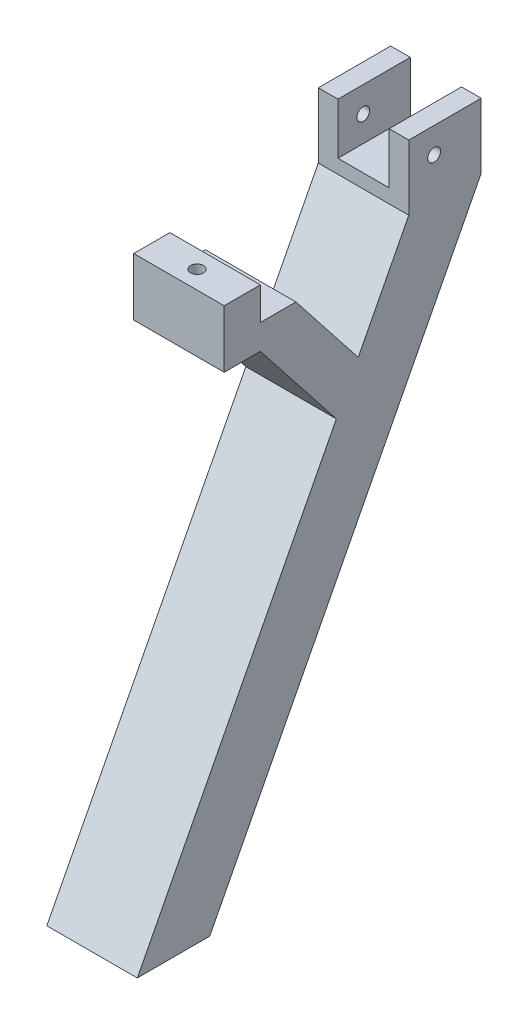
ISO-10303-21;
HEADER;
FILE_DESCRIPTION(('STEP AP214'),'2;1');
FILE_NAME('part.step','',(''),(''),'','','');
FILE_SCHEMA(('AUTOMOTIVE_DESIGN { 1 0 10303 214 1 1 1 1 }'));
ENDSEC;
DATA;
#1=APPLICATION_CONTEXT('core data for automotive mechanical design processes');
#2=APPLICATION_PROTOCOL_DEFINITION('international standard','automotive_design',2000,#1);
#3=PRODUCT_CONTEXT('',#1,'mechanical');
#4=PRODUCT('Part','Part','',(#3));
#5=PRODUCT_RELATED_PRODUCT_CATEGORY('part','',(#4));
#6=PRODUCT_DEFINITION_FORMATION('','',#4);
#7=PRODUCT_DEFINITION_CONTEXT('part definition',#1,'design');
#8=PRODUCT_DEFINITION('design','',#6,#7);
#9=PRODUCT_DEFINITION_SHAPE('','',#8);
#10=(LENGTH_UNIT() NAMED_UNIT(*) SI_UNIT(.MILLI.,.METRE.));
#11=(NAMED_UNIT(*) PLANE_ANGLE_UNIT() SI_UNIT($,.RADIAN.));
#12=(NAMED_UNIT(*) SI_UNIT($,.STERADIAN.) SOLID_ANGLE_UNIT());
#13=UNCERTAINTY_MEASURE_WITH_UNIT(LENGTH_MEASURE(1.E-05),#10,'distance_accuracy_value','');
#14=(GEOMETRIC_REPRESENTATION_CONTEXT(3) GLOBAL_UNCERTAINTY_ASSIGNED_CONTEXT((#13)) GLOBAL_UNIT_ASSIGNED_CONTEXT((#10,
#11,#12)) REPRESENTATION_CONTEXT('',''));
#15=CARTESIAN_POINT('',(0.,0.,0.));
#16=DIRECTION('',(0.,0.,1.));
#17=DIRECTION('',(1.,0.,0.));
#18=AXIS2_PLACEMENT_3D('',#15,#16,#17);
#19=CARTESIAN_POINT('',(25.,-336.427267807373,150.827871615715));
#20=DIRECTION('',(0.,-0.459422918873767,-0.888217643155949));
#21=DIRECTION('',(0.,0.888217643155949,-0.459422918873767));
#22=AXIS2_PLACEMENT_3D('',#19,#20,#21);
#23=PLANE('',#22);
#24=DIRECTION('',(0.,-0.888217643155949,0.459422918873767));
#25=VECTOR('',#24,1.);
#26=CARTESIAN_POINT('',(0.,-336.427267807373,150.827871615715));
#27=LINE('',#26,#25);
#28=CARTESIAN_POINT('',(0.,-191.427267807373,75.8278716157152));
#29=VERTEX_POINT('',#28);
#30=CARTESIAN_POINT('',(0.,-218.427267807373,89.7933888570945));
#31=VERTEX_POINT('',#30);
#32=EDGE_CURVE('E283',#29,#31,#27,.T.);
#33=ORIENTED_EDGE('',*,*,#32,.T.);
#34=DIRECTION('',(1.,0.,0.));
#35=VECTOR('',#34,1.);
#36=CARTESIAN_POINT('',(0.,-218.427267807373,89.7933888570945));
#37=LINE('',#36,#35);
#38=CARTESIAN_POINT('',(25.,-218.427267807373,89.7933888570945));
#39=VERTEX_POINT('',#38);
#40=EDGE_CURVE('E56',#31,#39,#37,.T.);
#41=ORIENTED_EDGE('',*,*,#40,.T.);
#42=DIRECTION('',(0.,-0.888217643155949,0.459422918873767));
#43=VECTOR('',#42,1.);
#44=CARTESIAN_POINT('',(25.,-222.360601140706,91.8278716157151));
#45=LINE('',#44,#43);
#46=CARTESIAN_POINT('',(25.,-191.427267807373,75.8278716157152));
#47=VERTEX_POINT('',#46);
#48=EDGE_CURVE('E269',#47,#39,#45,.T.);
#49=ORIENTED_EDGE('',*,*,#48,.F.);
#50=DIRECTION('',(-1.,0.,0.));
#51=VECTOR('',#50,1.);
#52=CARTESIAN_POINT('',(25.,-191.427267807373,75.8278716157152));
#53=LINE('',#52,#51);
#54=EDGE_CURVE('E11',#47,#29,#53,.T.);
#55=ORIENTED_EDGE('',*,*,#54,.T.);
#56=EDGE_LOOP('',(#33,#41,#49,#55));
#57=FACE_BOUND('',#56,.T.);
#58=ADVANCED_FACE('F32',(#57),#23,.F.);
#59=CARTESIAN_POINT('',(25.,-173.427267807373,75.8278716157152));
#60=DIRECTION('',(0.,-1.,0.));
#61=DIRECTION('',(0.,0.,-1.));
#62=AXIS2_PLACEMENT_3D('',#59,#60,#61);
#63=PLANE('',#62);
#64=DIRECTION('',(-1.,0.,0.));
#65=VECTOR('',#64,1.);
#66=CARTESIAN_POINT('',(25.,-173.427267807373,75.8278716157152));
#67=LINE('',#66,#65);
#68=CARTESIAN_POINT('',(5.425,-173.427267807373,75.8278716157152));
#69=VERTEX_POINT('',#68);
#70=CARTESIAN_POINT('',(0.,-173.427267807373,75.8278716157152));
#71=VERTEX_POINT('',#70);
#72=EDGE_CURVE('E279',#69,#71,#67,.T.);
#73=ORIENTED_EDGE('',*,*,#72,.F.);
#74=DIRECTION('',(0.,0.,1.));
#75=VECTOR('',#74,1.);
#76=CARTESIAN_POINT('',(5.425,-173.427267807373,55.8278716157151));
#77=LINE('',#76,#75);
#78=CARTESIAN_POINT('',(5.425,-173.427267807373,55.8278716157151));
#79=VERTEX_POINT('',#78);
#80=EDGE_CURVE('E256',#79,#69,#77,.T.);
#81=ORIENTED_EDGE('',*,*,#80,.F.);
#82=DIRECTION('',(-1.,0.,0.));
#83=VECTOR('',#82,1.);
#84=CARTESIAN_POINT('',(25.,-173.427267807373,55.8278716157151));
#85=LINE('',#84,#83);
#86=CARTESIAN_POINT('',(0.,-173.427267807373,55.8278716157151));
#87=VERTEX_POINT('',#86);
#88=EDGE_CURVE('E297',#79,#87,#85,.T.);
#89=ORIENTED_EDGE('',*,*,#88,.T.);
#90=DIRECTION('',(0.,0.,1.));
#91=VECTOR('',#90,1.);
#92=CARTESIAN_POINT('',(0.,-173.427267807373,75.8278716157152));
#93=LINE('',#92,#91);
#94=EDGE_CURVE('E268',#87,#71,#93,.T.);
#95=ORIENTED_EDGE('',*,*,#94,.T.);
#96=EDGE_LOOP('',(#73,#81,#89,#95));
#97=FACE_BOUND('',#96,.T.);
#98=ADVANCED_FACE('F339',(#97),#63,.F.);
#99=CARTESIAN_POINT('',(25.,-191.427267807373,75.8278716157152));
#100=DIRECTION('',(0.,0.,-1.));
#101=DIRECTION('',(-1.,0.,0.));
#102=AXIS2_PLACEMENT_3D('',#99,#100,#101);
#103=PLANE('',#102);
#104=DIRECTION('',(1.,0.,0.));
#105=VECTOR('',#104,1.);
#106=CARTESIAN_POINT('',(5.425,-187.577267807373,75.8278716157152));
#107=LINE('',#106,#105);
#108=CARTESIAN_POINT('',(5.425,-187.577267807373,75.8278716157152));
#109=VERTEX_POINT('',#108);
#110=CARTESIAN_POINT('',(19.575,-187.577267807373,75.8278716157152));
#111=VERTEX_POINT('',#110);
#112=EDGE_CURVE('E252',#109,#111,#107,.T.);
#113=ORIENTED_EDGE('',*,*,#112,.F.);
#114=DIRECTION('',(0.,-1.,0.));
#115=VECTOR('',#114,1.);
#116=CARTESIAN_POINT('',(5.425,-173.427267807373,75.8278716157152));
#117=LINE('',#116,#115);
#118=EDGE_CURVE('E238',#69,#109,#117,.T.);
#119=ORIENTED_EDGE('',*,*,#118,.F.);
#120=ORIENTED_EDGE('',*,*,#72,.T.);
#121=DIRECTION('',(0.,-1.,0.));
#122=VECTOR('',#121,1.);
#123=CARTESIAN_POINT('',(0.,-191.427267807373,75.8278716157152));
#124=LINE('',#123,#122);
#125=EDGE_CURVE('E258',#71,#29,#124,.T.);
#126=ORIENTED_EDGE('',*,*,#125,.T.);
#127=ORIENTED_EDGE('',*,*,#54,.F.);
#128=DIRECTION('',(0.,-1.,0.));
#129=VECTOR('',#128,1.);
#130=CARTESIAN_POINT('',(25.,-191.427267807373,75.8278716157152));
#131=LINE('',#130,#129);
#132=CARTESIAN_POINT('',(25.,-173.427267807373,75.8278716157152));
#133=VERTEX_POINT('',#132);
#134=EDGE_CURVE('E265',#133,#47,#131,.T.);
#135=ORIENTED_EDGE('',*,*,#134,.F.);
#136=CARTESIAN_POINT('',(19.575,-173.427267807373,75.8278716157152));
#137=VERTEX_POINT('',#136);
#138=EDGE_CURVE('E294',#133,#137,#67,.T.);
#139=ORIENTED_EDGE('',*,*,#138,.T.);
#140=DIRECTION('',(0.,1.,0.));
#141=VECTOR('',#140,1.);
#142=CARTESIAN_POINT('',(19.575,-173.427267807373,75.8278716157152));
#143=LINE('',#142,#141);
#144=EDGE_CURVE('E243',#111,#137,#143,.T.);
#145=ORIENTED_EDGE('',*,*,#144,.F.);
#146=EDGE_LOOP('',(#113,#119,#120,#126,#127,#135,#139,#145));
#147=FACE_BOUND('',#146,.T.);
#148=ADVANCED_FACE('F34',(#147),#103,.F.);
#149=CARTESIAN_POINT('',(25.,-230.132827832701,95.8479888701954));
#150=VERTEX_POINT('',#149);
#151=CARTESIAN_POINT('',(25.,-336.427267807373,150.827871615715));
#152=VERTEX_POINT('',#151);
#153=EDGE_CURVE('E48',#150,#152,#45,.T.);
#154=ORIENTED_EDGE('',*,*,#153,.F.);
#155=DIRECTION('',(1.,0.,0.));
#156=VECTOR('',#155,1.);
#157=CARTESIAN_POINT('',(0.,-230.132827832702,95.8479888701953));
#158=LINE('',#157,#156);
#159=CARTESIAN_POINT('',(0.,-230.132827832702,95.8479888701953));
#160=VERTEX_POINT('',#159);
#161=EDGE_CURVE('E227',#160,#150,#158,.T.);
#162=ORIENTED_EDGE('',*,*,#161,.F.);
#163=CARTESIAN_POINT('',(0.,-336.427267807373,150.827871615715));
#164=VERTEX_POINT('',#163);
#165=EDGE_CURVE('E282',#160,#164,#27,.T.);
#166=ORIENTED_EDGE('',*,*,#165,.T.);
#167=DIRECTION('',(-1.,0.,0.));
#168=VECTOR('',#167,1.);
#169=CARTESIAN_POINT('',(25.,-336.427267807373,150.827871615715));
#170=LINE('',#169,#168);
#171=EDGE_CURVE('E41',#152,#164,#170,.T.);
#172=ORIENTED_EDGE('',*,*,#171,.F.);
#173=EDGE_LOOP('',(#154,#162,#166,#172));
#174=FACE_BOUND('',#173,.T.);
#175=ADVANCED_FACE('F332',(#174),#23,.F.);
#176=CARTESIAN_POINT('',(25.,-336.427267807373,130.827871615715));
#177=DIRECTION('',(0.,1.,0.));
#178=DIRECTION('',(0.,0.,1.));
#179=AXIS2_PLACEMENT_3D('',#176,#177,#178);
#180=PLANE('',#179);
#181=DIRECTION('',(0.,0.,-1.));
#182=VECTOR('',#181,1.);
#183=CARTESIAN_POINT('',(0.,-336.427267807373,130.827871615715));
#184=LINE('',#183,#182);
#185=CARTESIAN_POINT('',(0.,-336.427267807373,130.827871615715));
#186=VERTEX_POINT('',#185);
#187=EDGE_CURVE('E285',#164,#186,#184,.T.);
#188=ORIENTED_EDGE('',*,*,#187,.T.);
#189=DIRECTION('',(-1.,0.,0.));
#190=VECTOR('',#189,1.);
#191=CARTESIAN_POINT('',(25.,-336.427267807373,130.827871615715));
#192=LINE('',#191,#190);
#193=CARTESIAN_POINT('',(25.,-336.427267807373,130.827871615715));
#194=VERTEX_POINT('',#193);
#195=EDGE_CURVE('E304',#194,#186,#192,.T.);
#196=ORIENTED_EDGE('',*,*,#195,.F.);
#197=DIRECTION('',(0.,0.,-1.));
#198=VECTOR('',#197,1.);
#199=CARTESIAN_POINT('',(25.,-336.427267807373,130.827871615715));
#200=LINE('',#199,#198);
#201=EDGE_CURVE('E271',#152,#194,#200,.T.);
#202=ORIENTED_EDGE('',*,*,#201,.F.);
#203=ORIENTED_EDGE('',*,*,#171,.T.);
#204=EDGE_LOOP('',(#188,#196,#202,#203));
#205=FACE_BOUND('',#204,.T.);
#206=ADVANCED_FACE('F311',(#205),#180,.F.);
#207=CARTESIAN_POINT('',(25.,-191.427267807373,55.8278716157151));
#208=DIRECTION('',(0.,0.459422918873767,0.888217643155949));
#209=DIRECTION('',(0.,-0.888217643155949,0.459422918873767));
#210=AXIS2_PLACEMENT_3D('',#207,#208,#209);
#211=PLANE('',#210);
#212=DIRECTION('',(0.,0.888217643155949,-0.459422918873767));
#213=VECTOR('',#212,1.);
#214=CARTESIAN_POINT('',(0.,-191.427267807373,55.8278716157151));
#215=LINE('',#214,#213);
#216=CARTESIAN_POINT('',(0.,-191.427267807373,55.8278716157151));
#217=VERTEX_POINT('',#216);
#218=EDGE_CURVE('E287',#186,#217,#215,.T.);
#219=ORIENTED_EDGE('',*,*,#218,.T.);
#220=DIRECTION('',(-1.,0.,0.));
#221=VECTOR('',#220,1.);
#222=CARTESIAN_POINT('',(25.,-191.427267807373,55.8278716157151));
#223=LINE('',#222,#221);
#224=CARTESIAN_POINT('',(25.,-191.427267807373,55.8278716157151));
#225=VERTEX_POINT('',#224);
#226=EDGE_CURVE('E301',#225,#217,#223,.T.);
#227=ORIENTED_EDGE('',*,*,#226,.F.);
#228=DIRECTION('',(0.,0.888217643155949,-0.459422918873767));
#229=VECTOR('',#228,1.);
#230=CARTESIAN_POINT('',(25.,-191.427267807373,55.8278716157151));
#231=LINE('',#230,#229);
#232=EDGE_CURVE('E273',#194,#225,#231,.T.);
#233=ORIENTED_EDGE('',*,*,#232,.F.);
#234=ORIENTED_EDGE('',*,*,#195,.T.);
#235=EDGE_LOOP('',(#219,#227,#233,#234));
#236=FACE_BOUND('',#235,.T.);
#237=ADVANCED_FACE('F318',(#236),#211,.F.);
#238=CARTESIAN_POINT('',(25.,-173.427267807373,55.8278716157151));
#239=DIRECTION('',(0.,0.,1.));
#240=DIRECTION('',(1.,0.,0.));
#241=AXIS2_PLACEMENT_3D('',#238,#239,#240);
#242=PLANE('',#241);
#243=ORIENTED_EDGE('',*,*,#88,.F.);
#244=DIRECTION('',(0.,-1.,0.));
#245=VECTOR('',#244,1.);
#246=CARTESIAN_POINT('',(5.425,-173.427267807373,55.8278716157151));
#247=LINE('',#246,#245);
#248=CARTESIAN_POINT('',(5.425,-187.577267807373,55.8278716157151));
#249=VERTEX_POINT('',#248);
#250=EDGE_CURVE('E239',#79,#249,#247,.T.);
#251=ORIENTED_EDGE('',*,*,#250,.T.);
#252=DIRECTION('',(1.,0.,0.));
#253=VECTOR('',#252,1.);
#254=CARTESIAN_POINT('',(5.425,-187.577267807373,55.8278716157151));
#255=LINE('',#254,#253);
#256=CARTESIAN_POINT('',(19.575,-187.577267807373,55.8278716157151));
#257=VERTEX_POINT('',#256);
#258=EDGE_CURVE('E242',#249,#257,#255,.T.);
#259=ORIENTED_EDGE('',*,*,#258,.T.);
#260=DIRECTION('',(0.,1.,0.));
#261=VECTOR('',#260,1.);
#262=CARTESIAN_POINT('',(19.575,-173.427267807373,55.8278716157151));
#263=LINE('',#262,#261);
#264=CARTESIAN_POINT('',(19.575,-173.427267807373,55.8278716157151));
#265=VERTEX_POINT('',#264);
#266=EDGE_CURVE('E246',#257,#265,#263,.T.);
#267=ORIENTED_EDGE('',*,*,#266,.T.);
#268=CARTESIAN_POINT('',(25.,-173.427267807373,55.8278716157151));
#269=VERTEX_POINT('',#268);
#270=EDGE_CURVE('E298',#269,#265,#85,.T.);
#271=ORIENTED_EDGE('',*,*,#270,.F.);
#272=DIRECTION('',(0.,1.,0.));
#273=VECTOR('',#272,1.);
#274=CARTESIAN_POINT('',(25.,-173.427267807373,55.8278716157151));
#275=LINE('',#274,#273);
#276=EDGE_CURVE('E275',#225,#269,#275,.T.);
#277=ORIENTED_EDGE('',*,*,#276,.F.);
#278=ORIENTED_EDGE('',*,*,#226,.T.);
#279=DIRECTION('',(0.,1.,0.));
#280=VECTOR('',#279,1.);
#281=CARTESIAN_POINT('',(0.,-173.427267807373,55.8278716157151));
#282=LINE('',#281,#280);
#283=EDGE_CURVE('E289',#217,#87,#282,.T.);
#284=ORIENTED_EDGE('',*,*,#283,.T.);
#285=EDGE_LOOP('',(#243,#251,#259,#267,#271,#277,#278,#284));
#286=FACE_BOUND('',#285,.T.);
#287=ADVANCED_FACE('F323',(#286),#242,.F.);
#288=ORIENTED_EDGE('',*,*,#270,.T.);
#289=DIRECTION('',(0.,0.,1.));
#290=VECTOR('',#289,1.);
#291=CARTESIAN_POINT('',(19.575,-173.427267807373,55.8278716157151));
#292=LINE('',#291,#290);
#293=EDGE_CURVE('E259',#265,#137,#292,.T.);
#294=ORIENTED_EDGE('',*,*,#293,.T.);
#295=ORIENTED_EDGE('',*,*,#138,.F.);
#296=DIRECTION('',(0.,0.,1.));
#297=VECTOR('',#296,1.);
#298=CARTESIAN_POINT('',(25.,-173.427267807373,75.8278716157152));
#299=LINE('',#298,#297);
#300=EDGE_CURVE('E277',#269,#133,#299,.T.);
#301=ORIENTED_EDGE('',*,*,#300,.F.);
#302=EDGE_LOOP('',(#288,#294,#295,#301));
#303=FACE_BOUND('',#302,.T.);
#304=ADVANCED_FACE('F347',(#303),#63,.F.);
#305=CARTESIAN_POINT('',(25.,0.,0.));
#306=DIRECTION('',(-1.,0.,0.));
#307=DIRECTION('',(0.,0.,1.));
#308=AXIS2_PLACEMENT_3D('',#305,#306,#307);
#309=PLANE('',#308);
#310=CARTESIAN_POINT('',(25.,-180.477267807373,68.8278716157151));
#311=DIRECTION('',(1.,0.,0.));
#312=DIRECTION('',(0.,0.,-1.));
#313=AXIS2_PLACEMENT_3D('',#310,#311,#312);
#314=CIRCLE('',#313,1.775);
#315=CARTESIAN_POINT('',(25.,-180.477267807373,67.0528716157151));
#316=VERTEX_POINT('',#315);
#317=EDGE_CURVE('E219',#316,#316,#314,.T.);
#318=ORIENTED_EDGE('',*,*,#317,.F.);
#319=EDGE_LOOP('',(#318));
#320=FACE_BOUND('',#319,.T.);
#321=ORIENTED_EDGE('',*,*,#134,.T.);
#322=ORIENTED_EDGE('',*,*,#48,.T.);
#323=DIRECTION('',(0.,0.78550120175249,0.618860131245658));
#324=VECTOR('',#323,1.);
#325=CARTESIAN_POINT('',(25.,-196.577267807373,107.007995069726));
#326=LINE('',#325,#324);
#327=CARTESIAN_POINT('',(25.,-196.577267807373,107.007995069726));
#328=VERTEX_POINT('',#327);
#329=EDGE_CURVE('E207',#39,#328,#326,.T.);
#330=ORIENTED_EDGE('',*,*,#329,.T.);
#331=DIRECTION('',(0.,0.,1.));
#332=VECTOR('',#331,1.);
#333=CARTESIAN_POINT('',(25.,-196.577267807373,116.827871615715));
#334=LINE('',#333,#332);
#335=CARTESIAN_POINT('',(25.,-196.577267807373,116.827871615715));
#336=VERTEX_POINT('',#335);
#337=EDGE_CURVE('E210',#328,#336,#334,.T.);
#338=ORIENTED_EDGE('',*,*,#337,.T.);
#339=DIRECTION('',(0.,1.,0.));
#340=VECTOR('',#339,1.);
#341=CARTESIAN_POINT('',(25.,-187.577267807373,116.827871615715));
#342=LINE('',#341,#340);
#343=CARTESIAN_POINT('',(25.,-187.577267807373,116.827871615715));
#344=VERTEX_POINT('',#343);
#345=EDGE_CURVE('E213',#336,#344,#342,.T.);
#346=ORIENTED_EDGE('',*,*,#345,.T.);
#347=DIRECTION('',(0.,0.,1.));
#348=VECTOR('',#347,1.);
#349=CARTESIAN_POINT('',(25.,-187.577267807373,126.827871615715));
#350=LINE('',#349,#348);
#351=CARTESIAN_POINT('',(25.,-187.577267807373,126.827871615715));
#352=VERTEX_POINT('',#351);
#353=EDGE_CURVE('E170',#344,#352,#350,.T.);
#354=ORIENTED_EDGE('',*,*,#353,.T.);
#355=DIRECTION('',(0.,-1.,0.));
#356=VECTOR('',#355,1.);
#357=CARTESIAN_POINT('',(25.,-203.503671619227,126.827871615715));
#358=LINE('',#357,#356);
#359=CARTESIAN_POINT('',(25.,-203.503671619227,126.827871615715));
#360=VERTEX_POINT('',#359);
#361=EDGE_CURVE('E200',#352,#360,#358,.T.);
#362=ORIENTED_EDGE('',*,*,#361,.T.);
#363=DIRECTION('',(0.,0.,-1.));
#364=VECTOR('',#363,1.);
#365=CARTESIAN_POINT('',(25.,-203.503671619227,116.827871615715));
#366=LINE('',#365,#364);
#367=CARTESIAN_POINT('',(25.,-203.503671619227,116.827871615715));
#368=VERTEX_POINT('',#367);
#369=EDGE_CURVE('E176',#360,#368,#366,.T.);
#370=ORIENTED_EDGE('',*,*,#369,.T.);
#371=DIRECTION('',(0.,-0.78550120175249,-0.618860131245658));
#372=VECTOR('',#371,1.);
#373=CARTESIAN_POINT('',(25.,-230.132827832702,95.8479888701953));
#374=LINE('',#373,#372);
#375=EDGE_CURVE('E204',#368,#150,#374,.T.);
#376=ORIENTED_EDGE('',*,*,#375,.T.);
#377=ORIENTED_EDGE('',*,*,#153,.T.);
#378=ORIENTED_EDGE('',*,*,#201,.T.);
#379=ORIENTED_EDGE('',*,*,#232,.T.);
#380=ORIENTED_EDGE('',*,*,#276,.T.);
#381=ORIENTED_EDGE('',*,*,#300,.T.);
#382=EDGE_LOOP('',(#321,#322,#330,#338,#346,#354,#362,#370,#376,#377,#378,#379,#380,#381));
#383=FACE_BOUND('',#382,.T.);
#384=ADVANCED_FACE('F327',(#320,#383),#309,.F.);
#385=CARTESIAN_POINT('',(0.,0.,0.));
#386=DIRECTION('',(-1.,0.,0.));
#387=DIRECTION('',(0.,0.,1.));
#388=AXIS2_PLACEMENT_3D('',#385,#386,#387);
#389=PLANE('',#388);
#390=CARTESIAN_POINT('',(0.,-180.477267807373,68.8278716157151));
#391=DIRECTION('',(-1.,0.,0.));
#392=DIRECTION('',(0.,0.,1.));
#393=AXIS2_PLACEMENT_3D('',#390,#391,#392);
#394=CIRCLE('',#393,1.775);
#395=CARTESIAN_POINT('',(0.,-180.477267807373,70.6028716157151));
#396=VERTEX_POINT('',#395);
#397=EDGE_CURVE('E232',#396,#396,#394,.F.);
#398=ORIENTED_EDGE('',*,*,#397,.T.);
#399=EDGE_LOOP('',(#398));
#400=FACE_BOUND('',#399,.T.);
#401=ORIENTED_EDGE('',*,*,#125,.F.);
#402=ORIENTED_EDGE('',*,*,#94,.F.);
#403=ORIENTED_EDGE('',*,*,#283,.F.);
#404=ORIENTED_EDGE('',*,*,#218,.F.);
#405=ORIENTED_EDGE('',*,*,#187,.F.);
#406=ORIENTED_EDGE('',*,*,#165,.F.);
#407=DIRECTION('',(0.,-0.78550120175249,-0.618860131245658));
#408=VECTOR('',#407,1.);
#409=CARTESIAN_POINT('',(0.,-230.132827832702,95.8479888701953));
#410=LINE('',#409,#408);
#411=CARTESIAN_POINT('',(0.,-203.503671619227,116.827871615715));
#412=VERTEX_POINT('',#411);
#413=EDGE_CURVE('E185',#412,#160,#410,.T.);
#414=ORIENTED_EDGE('',*,*,#413,.F.);
#415=DIRECTION('',(0.,0.,-1.));
#416=VECTOR('',#415,1.);
#417=CARTESIAN_POINT('',(0.,-203.503671619227,116.827871615715));
#418=LINE('',#417,#416);
#419=CARTESIAN_POINT('',(0.,-203.503671619227,126.827871615715));
#420=VERTEX_POINT('',#419);
#421=EDGE_CURVE('E169',#420,#412,#418,.T.);
#422=ORIENTED_EDGE('',*,*,#421,.F.);
#423=DIRECTION('',(0.,-1.,0.));
#424=VECTOR('',#423,1.);
#425=CARTESIAN_POINT('',(0.,-187.577267807373,126.827871615715));
#426=LINE('',#425,#424);
#427=CARTESIAN_POINT('',(0.,-187.577267807373,126.827871615715));
#428=VERTEX_POINT('',#427);
#429=EDGE_CURVE('E158',#428,#420,#426,.T.);
#430=ORIENTED_EDGE('',*,*,#429,.F.);
#431=DIRECTION('',(0.,0.,1.));
#432=VECTOR('',#431,1.);
#433=CARTESIAN_POINT('',(0.,-187.577267807373,126.827871615715));
#434=LINE('',#433,#432);
#435=CARTESIAN_POINT('',(0.,-187.577267807373,116.827871615715));
#436=VERTEX_POINT('',#435);
#437=EDGE_CURVE('E179',#436,#428,#434,.T.);
#438=ORIENTED_EDGE('',*,*,#437,.F.);
#439=DIRECTION('',(0.,1.,0.));
#440=VECTOR('',#439,1.);
#441=CARTESIAN_POINT('',(0.,-187.577267807373,116.827871615715));
#442=LINE('',#441,#440);
#443=CARTESIAN_POINT('',(0.,-196.577267807373,116.827871615715));
#444=VERTEX_POINT('',#443);
#445=EDGE_CURVE('E196',#444,#436,#442,.T.);
#446=ORIENTED_EDGE('',*,*,#445,.F.);
#447=DIRECTION('',(0.,0.,1.));
#448=VECTOR('',#447,1.);
#449=CARTESIAN_POINT('',(0.,-196.577267807373,116.827871615715));
#450=LINE('',#449,#448);
#451=CARTESIAN_POINT('',(0.,-196.577267807373,107.007995069726));
#452=VERTEX_POINT('',#451);
#453=EDGE_CURVE('E193',#452,#444,#450,.T.);
#454=ORIENTED_EDGE('',*,*,#453,.F.);
#455=DIRECTION('',(0.,0.78550120175249,0.618860131245658));
#456=VECTOR('',#455,1.);
#457=CARTESIAN_POINT('',(0.,-196.577267807373,107.007995069726));
#458=LINE('',#457,#456);
#459=EDGE_CURVE('E187',#31,#452,#458,.T.);
#460=ORIENTED_EDGE('',*,*,#459,.F.);
#461=ORIENTED_EDGE('',*,*,#32,.F.);
#462=EDGE_LOOP('',(#401,#402,#403,#404,#405,#406,#414,#422,#430,#438,#446,#454,#460,#461));
#463=FACE_BOUND('',#462,.T.);
#464=ADVANCED_FACE('F183',(#400,#463),#389,.T.);
#465=CARTESIAN_POINT('',(5.425,-173.427267807373,55.8278716157151));
#466=DIRECTION('',(-1.,0.,0.));
#467=DIRECTION('',(0.,0.,1.));
#468=AXIS2_PLACEMENT_3D('',#465,#466,#467);
#469=PLANE('',#468);
#470=CARTESIAN_POINT('',(5.425,-180.477267807373,68.8278716157151));
#471=DIRECTION('',(-1.,0.,0.));
#472=DIRECTION('',(0.,0.,1.));
#473=AXIS2_PLACEMENT_3D('',#470,#471,#472);
#474=CIRCLE('',#473,1.775);
#475=CARTESIAN_POINT('',(5.425,-180.477267807373,70.6028716157151));
#476=VERTEX_POINT('',#475);
#477=EDGE_CURVE('E235',#476,#476,#474,.T.);
#478=ORIENTED_EDGE('',*,*,#477,.T.);
#479=EDGE_LOOP('',(#478));
#480=FACE_BOUND('',#479,.T.);
#481=ORIENTED_EDGE('',*,*,#118,.T.);
#482=DIRECTION('',(0.,0.,1.));
#483=VECTOR('',#482,1.);
#484=CARTESIAN_POINT('',(5.425,-187.577267807373,55.8278716157151));
#485=LINE('',#484,#483);
#486=EDGE_CURVE('E249',#249,#109,#485,.T.);
#487=ORIENTED_EDGE('',*,*,#486,.F.);
#488=ORIENTED_EDGE('',*,*,#250,.F.);
#489=ORIENTED_EDGE('',*,*,#80,.T.);
#490=EDGE_LOOP('',(#481,#487,#488,#489));
#491=FACE_BOUND('',#490,.T.);
#492=ADVANCED_FACE('F366',(#480,#491),#469,.F.);
#493=CARTESIAN_POINT('',(19.575,-173.427267807373,55.8278716157151));
#494=DIRECTION('',(1.,0.,0.));
#495=DIRECTION('',(0.,0.,-1.));
#496=AXIS2_PLACEMENT_3D('',#493,#494,#495);
#497=PLANE('',#496);
#498=CARTESIAN_POINT('',(19.575,-180.477267807373,68.8278716157151));
#499=DIRECTION('',(1.,0.,0.));
#500=DIRECTION('',(0.,0.,-1.));
#501=AXIS2_PLACEMENT_3D('',#498,#499,#500);
#502=CIRCLE('',#501,1.775);
#503=CARTESIAN_POINT('',(19.575,-180.477267807373,67.0528716157151));
#504=VERTEX_POINT('',#503);
#505=EDGE_CURVE('E36',#504,#504,#502,.T.);
#506=ORIENTED_EDGE('',*,*,#505,.T.);
#507=EDGE_LOOP('',(#506));
#508=FACE_BOUND('',#507,.T.);
#509=ORIENTED_EDGE('',*,*,#144,.T.);
#510=ORIENTED_EDGE('',*,*,#293,.F.);
#511=ORIENTED_EDGE('',*,*,#266,.F.);
#512=DIRECTION('',(0.,0.,1.));
#513=VECTOR('',#512,1.);
#514=CARTESIAN_POINT('',(19.575,-187.577267807373,55.8278716157151));
#515=LINE('',#514,#513);
#516=EDGE_CURVE('E262',#257,#111,#515,.T.);
#517=ORIENTED_EDGE('',*,*,#516,.T.);
#518=EDGE_LOOP('',(#509,#510,#511,#517));
#519=FACE_BOUND('',#518,.T.);
#520=ADVANCED_FACE('F372',(#508,#519),#497,.F.);
#521=CARTESIAN_POINT('',(5.425,-187.577267807373,55.8278716157151));
#522=DIRECTION('',(0.,-1.,0.));
#523=DIRECTION('',(0.,0.,-1.));
#524=AXIS2_PLACEMENT_3D('',#521,#522,#523);
#525=PLANE('',#524);
#526=ORIENTED_EDGE('',*,*,#112,.T.);
#527=ORIENTED_EDGE('',*,*,#516,.F.);
#528=ORIENTED_EDGE('',*,*,#258,.F.);
#529=ORIENTED_EDGE('',*,*,#486,.T.);
#530=EDGE_LOOP('',(#526,#527,#528,#529));
#531=FACE_BOUND('',#530,.T.);
#532=ADVANCED_FACE('F368',(#531),#525,.F.);
#533=CARTESIAN_POINT('',(-5.02045814642448,-180.477267807373,68.8278716157151));
#534=DIRECTION('',(1.,0.,0.));
#535=DIRECTION('',(0.,0.,-1.));
#536=AXIS2_PLACEMENT_3D('',#533,#534,#535);
#537=CYLINDRICAL_SURFACE('',#536,1.775);
#538=ORIENTED_EDGE('',*,*,#317,.T.);
#539=EDGE_LOOP('',(#538));
#540=FACE_BOUND('',#539,.T.);
#541=ORIENTED_EDGE('',*,*,#505,.F.);
#542=EDGE_LOOP('',(#541));
#543=FACE_BOUND('',#542,.T.);
#544=ADVANCED_FACE('F411',(#540,#543),#537,.F.);
#545=ORIENTED_EDGE('',*,*,#397,.F.);
#546=EDGE_LOOP('',(#545));
#547=FACE_BOUND('',#546,.T.);
#548=ORIENTED_EDGE('',*,*,#477,.F.);
#549=EDGE_LOOP('',(#548));
#550=FACE_BOUND('',#549,.T.);
#551=ADVANCED_FACE('F440',(#547,#550),#537,.F.);
#552=CARTESIAN_POINT('',(0.,-187.577267807373,126.827871615715));
#553=DIRECTION('',(0.,1.,0.));
#554=DIRECTION('',(0.,0.,1.));
#555=AXIS2_PLACEMENT_3D('',#552,#553,#554);
#556=PLANE('',#555);
#557=CARTESIAN_POINT('',(12.5,-187.577267807373,121.827871615715));
#558=DIRECTION('',(0.,1.,0.));
#559=DIRECTION('',(0.,0.,1.));
#560=AXIS2_PLACEMENT_3D('',#557,#558,#559);
#561=CIRCLE('',#560,1.775);
#562=CARTESIAN_POINT('',(12.5,-187.577267807373,123.602871615715));
#563=VERTEX_POINT('',#562);
#564=EDGE_CURVE('E553',#563,#563,#561,.T.);
#565=ORIENTED_EDGE('',*,*,#564,.F.);
#566=EDGE_LOOP('',(#565));
#567=FACE_BOUND('',#566,.T.);
#568=ORIENTED_EDGE('',*,*,#353,.F.);
#569=DIRECTION('',(1.,0.,0.));
#570=VECTOR('',#569,1.);
#571=CARTESIAN_POINT('',(0.,-187.577267807373,116.827871615715));
#572=LINE('',#571,#570);
#573=EDGE_CURVE('E220',#436,#344,#572,.T.);
#574=ORIENTED_EDGE('',*,*,#573,.F.);
#575=ORIENTED_EDGE('',*,*,#437,.T.);
#576=DIRECTION('',(1.,0.,0.));
#577=VECTOR('',#576,1.);
#578=CARTESIAN_POINT('',(0.,-187.577267807373,126.827871615715));
#579=LINE('',#578,#577);
#580=EDGE_CURVE('E164',#428,#352,#579,.T.);
#581=ORIENTED_EDGE('',*,*,#580,.T.);
#582=EDGE_LOOP('',(#568,#574,#575,#581));
#583=FACE_BOUND('',#582,.T.);
#584=ADVANCED_FACE('F449',(#567,#583),#556,.T.);
#585=CARTESIAN_POINT('',(0.,-187.577267807373,116.827871615715));
#586=DIRECTION('',(0.,0.,-1.));
#587=DIRECTION('',(-1.,0.,0.));
#588=AXIS2_PLACEMENT_3D('',#585,#586,#587);
#589=PLANE('',#588);
#590=ORIENTED_EDGE('',*,*,#345,.F.);
#591=DIRECTION('',(1.,0.,0.));
#592=VECTOR('',#591,1.);
#593=CARTESIAN_POINT('',(0.,-196.577267807373,116.827871615715));
#594=LINE('',#593,#592);
#595=EDGE_CURVE('E222',#444,#336,#594,.T.);
#596=ORIENTED_EDGE('',*,*,#595,.F.);
#597=ORIENTED_EDGE('',*,*,#445,.T.);
#598=ORIENTED_EDGE('',*,*,#573,.T.);
#599=EDGE_LOOP('',(#590,#596,#597,#598));
#600=FACE_BOUND('',#599,.T.);
#601=ADVANCED_FACE('F482',(#600),#589,.T.);
#602=CARTESIAN_POINT('',(0.,-196.577267807373,116.827871615715));
#603=DIRECTION('',(0.,1.,0.));
#604=DIRECTION('',(0.,0.,1.));
#605=AXIS2_PLACEMENT_3D('',#602,#603,#604);
#606=PLANE('',#605);
#607=ORIENTED_EDGE('',*,*,#337,.F.);
#608=DIRECTION('',(1.,0.,0.));
#609=VECTOR('',#608,1.);
#610=CARTESIAN_POINT('',(0.,-196.577267807373,107.007995069726));
#611=LINE('',#610,#609);
#612=EDGE_CURVE('E224',#452,#328,#611,.T.);
#613=ORIENTED_EDGE('',*,*,#612,.F.);
#614=ORIENTED_EDGE('',*,*,#453,.T.);
#615=ORIENTED_EDGE('',*,*,#595,.T.);
#616=EDGE_LOOP('',(#607,#613,#614,#615));
#617=FACE_BOUND('',#616,.T.);
#618=ADVANCED_FACE('F357',(#617),#606,.T.);
#619=CARTESIAN_POINT('',(0.,-196.577267807373,107.007995069726));
#620=DIRECTION('',(0.,0.618860131245659,-0.78550120175249));
#621=DIRECTION('',(0.,0.78550120175249,0.618860131245658));
#622=AXIS2_PLACEMENT_3D('',#619,#620,#621);
#623=PLANE('',#622);
#624=ORIENTED_EDGE('',*,*,#329,.F.);
#625=ORIENTED_EDGE('',*,*,#40,.F.);
#626=ORIENTED_EDGE('',*,*,#459,.T.);
#627=ORIENTED_EDGE('',*,*,#612,.T.);
#628=EDGE_LOOP('',(#624,#625,#626,#627));
#629=FACE_BOUND('',#628,.T.);
#630=ADVANCED_FACE('F352',(#629),#623,.T.);
#631=CARTESIAN_POINT('',(0.,-230.132827832702,95.8479888701953));
#632=DIRECTION('',(0.,-0.618860131245658,0.78550120175249));
#633=DIRECTION('',(0.,-0.78550120175249,-0.618860131245658));
#634=AXIS2_PLACEMENT_3D('',#631,#632,#633);
#635=PLANE('',#634);
#636=ORIENTED_EDGE('',*,*,#375,.F.);
#637=DIRECTION('',(1.,0.,0.));
#638=VECTOR('',#637,1.);
#639=CARTESIAN_POINT('',(0.,-203.503671619227,116.827871615715));
#640=LINE('',#639,#638);
#641=EDGE_CURVE('E178',#412,#368,#640,.T.);
#642=ORIENTED_EDGE('',*,*,#641,.F.);
#643=ORIENTED_EDGE('',*,*,#413,.T.);
#644=ORIENTED_EDGE('',*,*,#161,.T.);
#645=EDGE_LOOP('',(#636,#642,#643,#644));
#646=FACE_BOUND('',#645,.T.);
#647=ADVANCED_FACE('F331',(#646),#635,.T.);
#648=CARTESIAN_POINT('',(0.,-203.503671619227,116.827871615715));
#649=DIRECTION('',(0.,-1.,0.));
#650=DIRECTION('',(0.,0.,-1.));
#651=AXIS2_PLACEMENT_3D('',#648,#649,#650);
#652=PLANE('',#651);
#653=CARTESIAN_POINT('',(12.5,-203.503671619227,121.827871615715));
#654=DIRECTION('',(0.,-1.,0.));
#655=DIRECTION('',(0.,0.,-1.));
#656=AXIS2_PLACEMENT_3D('',#653,#654,#655);
#657=CIRCLE('',#656,1.775);
#658=CARTESIAN_POINT('',(12.5,-203.503671619227,120.052871615715));
#659=VERTEX_POINT('',#658);
#660=EDGE_CURVE('E202',#659,#659,#657,.F.);
#661=ORIENTED_EDGE('',*,*,#660,.T.);
#662=EDGE_LOOP('',(#661));
#663=FACE_BOUND('',#662,.T.);
#664=ORIENTED_EDGE('',*,*,#369,.F.);
#665=DIRECTION('',(1.,0.,0.));
#666=VECTOR('',#665,1.);
#667=CARTESIAN_POINT('',(0.,-203.503671619227,126.827871615715));
#668=LINE('',#667,#666);
#669=EDGE_CURVE('E161',#420,#360,#668,.T.);
#670=ORIENTED_EDGE('',*,*,#669,.F.);
#671=ORIENTED_EDGE('',*,*,#421,.T.);
#672=ORIENTED_EDGE('',*,*,#641,.T.);
#673=EDGE_LOOP('',(#664,#670,#671,#672));
#674=FACE_BOUND('',#673,.T.);
#675=ADVANCED_FACE('F174',(#663,#674),#652,.T.);
#676=CARTESIAN_POINT('',(0.,-203.503671619227,126.827871615715));
#677=DIRECTION('',(0.,0.,1.));
#678=DIRECTION('',(1.,0.,0.));
#679=AXIS2_PLACEMENT_3D('',#676,#677,#678);
#680=PLANE('',#679);
#681=ORIENTED_EDGE('',*,*,#361,.F.);
#682=ORIENTED_EDGE('',*,*,#580,.F.);
#683=ORIENTED_EDGE('',*,*,#429,.T.);
#684=ORIENTED_EDGE('',*,*,#669,.T.);
#685=EDGE_LOOP('',(#681,#682,#683,#684));
#686=FACE_BOUND('',#685,.T.);
#687=ADVANCED_FACE('F160',(#686),#680,.T.);
#688=CARTESIAN_POINT('',(12.5,-208.524129765651,121.827871615715));
#689=DIRECTION('',(0.,1.,0.));
#690=DIRECTION('',(0.,0.,1.));
#691=AXIS2_PLACEMENT_3D('',#688,#689,#690);
#692=CYLINDRICAL_SURFACE('',#691,1.775);
#693=ORIENTED_EDGE('',*,*,#564,.T.);
#694=EDGE_LOOP('',(#693));
#695=FACE_BOUND('',#694,.T.);
#696=ORIENTED_EDGE('',*,*,#660,.F.);
#697=EDGE_LOOP('',(#696));
#698=FACE_BOUND('',#697,.T.);
#699=ADVANCED_FACE('F522',(#695,#698),#692,.F.);
#700=CLOSED_SHELL('',(#58,#98,#148,#175,#206,#237,#287,#304,#384,#464,#492,#520,#532,#544,#551,
#584,#601,#618,#630,#647,#675,#687,#699));
#701=MANIFOLD_SOLID_BREP('B2',#700);
#702=ADVANCED_BREP_SHAPE_REPRESENTATION('',(#18,#701),#14);
#703=SHAPE_DEFINITION_REPRESENTATION(#9,#702);
ENDSEC;
END-ISO-10303-21;
